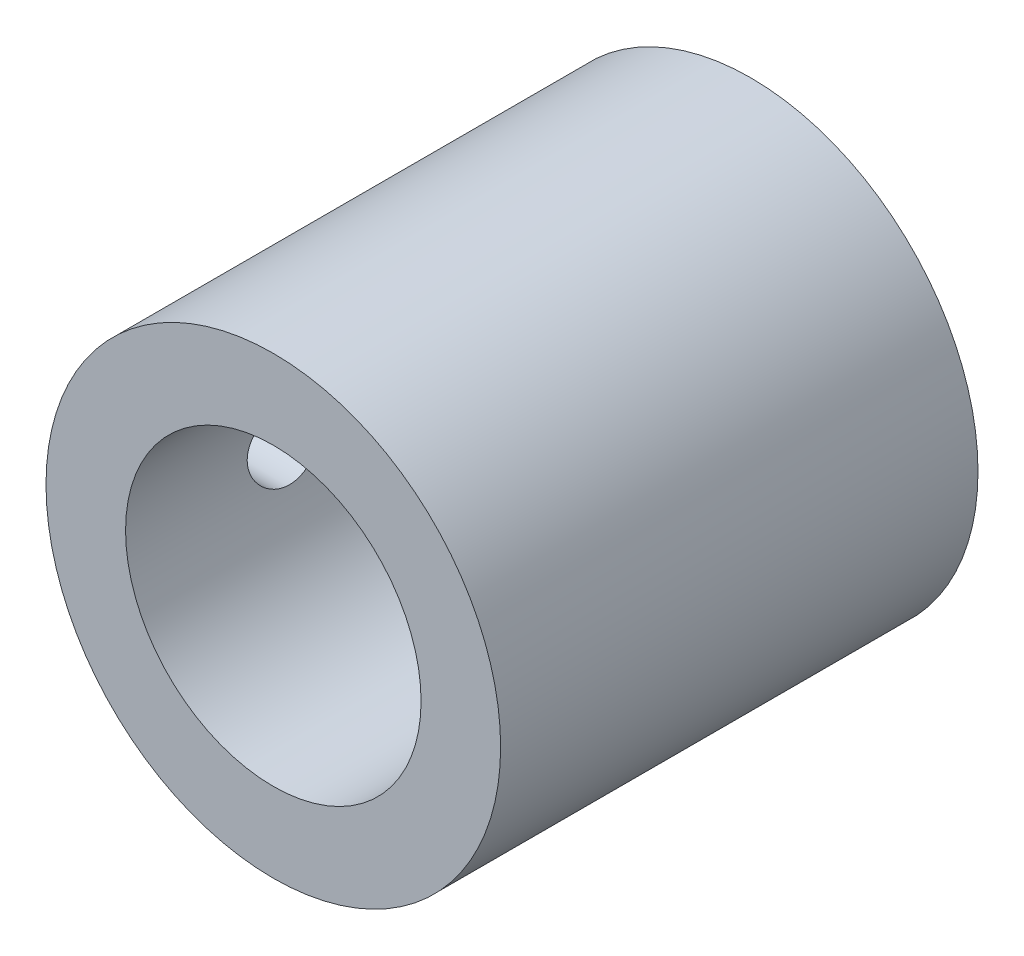
ISO-10303-21;
HEADER;
FILE_DESCRIPTION(('STEP AP214'),'2;1');
FILE_NAME('part.step','',(''),(''),'','','');
FILE_SCHEMA(('AUTOMOTIVE_DESIGN { 1 0 10303 214 1 1 1 1 }'));
ENDSEC;
DATA;
#1=APPLICATION_CONTEXT('core data for automotive mechanical design processes');
#2=APPLICATION_PROTOCOL_DEFINITION('international standard','automotive_design',2000,#1);
#3=PRODUCT_CONTEXT('',#1,'mechanical');
#4=PRODUCT('Part','Part','',(#3));
#5=PRODUCT_RELATED_PRODUCT_CATEGORY('part','',(#4));
#6=PRODUCT_DEFINITION_FORMATION('','',#4);
#7=PRODUCT_DEFINITION_CONTEXT('part definition',#1,'design');
#8=PRODUCT_DEFINITION('design','',#6,#7);
#9=PRODUCT_DEFINITION_SHAPE('','',#8);
#10=(LENGTH_UNIT() NAMED_UNIT(*) SI_UNIT(.MILLI.,.METRE.));
#11=(NAMED_UNIT(*) PLANE_ANGLE_UNIT() SI_UNIT($,.RADIAN.));
#12=(NAMED_UNIT(*) SI_UNIT($,.STERADIAN.) SOLID_ANGLE_UNIT());
#13=UNCERTAINTY_MEASURE_WITH_UNIT(LENGTH_MEASURE(1.E-05),#10,'distance_accuracy_value','');
#14=(GEOMETRIC_REPRESENTATION_CONTEXT(3) GLOBAL_UNCERTAINTY_ASSIGNED_CONTEXT((#13)) GLOBAL_UNIT_ASSIGNED_CONTEXT((#10,
#11,#12)) REPRESENTATION_CONTEXT('',''));
#15=CARTESIAN_POINT('',(0.,0.,0.));
#16=DIRECTION('',(0.,0.,1.));
#17=DIRECTION('',(1.,0.,0.));
#18=AXIS2_PLACEMENT_3D('',#15,#16,#17);
#19=CARTESIAN_POINT('',(0.,0.,0.));
#20=DIRECTION('',(0.,0.,1.));
#21=DIRECTION('',(1.,0.,0.));
#22=AXIS2_PLACEMENT_3D('',#19,#20,#21);
#23=PLANE('',#22);
#24=CARTESIAN_POINT('',(0.,0.,0.));
#25=DIRECTION('',(0.,0.,-1.));
#26=DIRECTION('',(-1.,0.,0.));
#27=AXIS2_PLACEMENT_3D('',#24,#25,#26);
#28=CIRCLE('',#27,3.35);
#29=CARTESIAN_POINT('',(-3.35,0.,0.));
#30=VERTEX_POINT('',#29);
#31=EDGE_CURVE('E184',#30,#30,#28,.T.);
#32=ORIENTED_EDGE('',*,*,#31,.F.);
#33=EDGE_LOOP('',(#32));
#34=FACE_BOUND('',#33,.T.);
#35=CARTESIAN_POINT('',(4.24264068711931,4.24264068711926,0.));
#36=DIRECTION('',(0.,0.,-1.));
#37=DIRECTION('',(-1.,0.,0.));
#38=AXIS2_PLACEMENT_3D('',#35,#36,#37);
#39=CIRCLE('',#38,1.24999999999999);
#40=CARTESIAN_POINT('',(2.99264068711932,4.24264068711926,0.));
#41=VERTEX_POINT('',#40);
#42=EDGE_CURVE('E90',#41,#41,#39,.T.);
#43=ORIENTED_EDGE('',*,*,#42,.F.);
#44=EDGE_LOOP('',(#43));
#45=FACE_BOUND('',#44,.T.);
#46=CARTESIAN_POINT('',(0.,0.,0.));
#47=DIRECTION('',(0.,0.,1.));
#48=DIRECTION('',(1.,0.,0.));
#49=AXIS2_PLACEMENT_3D('',#46,#47,#48);
#50=CIRCLE('',#49,10.);
#51=CARTESIAN_POINT('',(10.,0.,0.));
#52=VERTEX_POINT('',#51);
#53=EDGE_CURVE('E109',#52,#52,#50,.T.);
#54=ORIENTED_EDGE('',*,*,#53,.F.);
#55=EDGE_LOOP('',(#54));
#56=FACE_BOUND('',#55,.T.);
#57=CARTESIAN_POINT('',(4.24264068711931,-4.24264068711926,0.));
#58=DIRECTION('',(0.,0.,-1.));
#59=DIRECTION('',(-1.,0.,0.));
#60=AXIS2_PLACEMENT_3D('',#57,#58,#59);
#61=CIRCLE('',#60,1.24999999999999);
#62=CARTESIAN_POINT('',(2.99264068711932,-4.24264068711926,0.));
#63=VERTEX_POINT('',#62);
#64=EDGE_CURVE('E194',#63,#63,#61,.T.);
#65=ORIENTED_EDGE('',*,*,#64,.F.);
#66=EDGE_LOOP('',(#65));
#67=FACE_BOUND('',#66,.T.);
#68=CARTESIAN_POINT('',(-4.24264068711931,-4.24264068711926,0.));
#69=DIRECTION('',(0.,0.,-1.));
#70=DIRECTION('',(-1.,0.,0.));
#71=AXIS2_PLACEMENT_3D('',#68,#69,#70);
#72=CIRCLE('',#71,1.24999999999999);
#73=CARTESIAN_POINT('',(-5.4926406871193,-4.24264068711926,0.));
#74=VERTEX_POINT('',#73);
#75=EDGE_CURVE('E136',#74,#74,#72,.T.);
#76=ORIENTED_EDGE('',*,*,#75,.F.);
#77=EDGE_LOOP('',(#76));
#78=FACE_BOUND('',#77,.T.);
#79=CARTESIAN_POINT('',(-4.24264068711928,4.24264068711929,0.));
#80=DIRECTION('',(0.,0.,-1.));
#81=DIRECTION('',(-1.,0.,0.));
#82=AXIS2_PLACEMENT_3D('',#79,#80,#81);
#83=CIRCLE('',#82,1.24999999999999);
#84=CARTESIAN_POINT('',(-5.49264068711926,4.24264068711929,0.));
#85=VERTEX_POINT('',#84);
#86=EDGE_CURVE('E127',#85,#85,#83,.T.);
#87=ORIENTED_EDGE('',*,*,#86,.F.);
#88=EDGE_LOOP('',(#87));
#89=FACE_BOUND('',#88,.T.);
#90=ADVANCED_FACE('F41',(#34,#45,#56,#67,#78,#89),#23,.F.);
#91=CARTESIAN_POINT('',(0.,0.,21.));
#92=DIRECTION('',(0.,0.,-1.));
#93=DIRECTION('',(-1.,0.,0.));
#94=AXIS2_PLACEMENT_3D('',#91,#92,#93);
#95=CYLINDRICAL_SURFACE('',#94,10.);
#96=CARTESIAN_POINT('',(-10.,0.,15.65));
#97=CARTESIAN_POINT('',(-9.99999843258099,-0.0920114531057511,15.6499962990147));
#98=CARTESIAN_POINT('',(-9.99871684765511,-0.184073454347172,15.6422775413146));
#99=CARTESIAN_POINT('',(-9.99372775496381,-0.365616322535329,15.6116187648621));
#100=CARTESIAN_POINT('',(-9.99001800272159,-0.455094721351768,15.5886646630412));
#101=CARTESIAN_POINT('',(-9.98058875631552,-0.628817487751614,15.5282463610641));
#102=CARTESIAN_POINT('',(-9.974870893487,-0.713066038744484,15.4907939364397));
#103=CARTESIAN_POINT('',(-9.96205444853338,-0.87407223650404,15.4024727458514));
#104=CARTESIAN_POINT('',(-9.95495602786423,-0.950830757653326,15.351605548495));
#105=CARTESIAN_POINT('',(-9.9400912001718,-1.09540879372213,15.2373912228671));
#106=CARTESIAN_POINT('',(-9.93231968689365,-1.16314787882339,15.1739429363817));
#107=CARTESIAN_POINT('',(-9.9170237472334,-1.28706950777735,15.0365852264068));
#108=CARTESIAN_POINT('',(-9.90949933632427,-1.34325132909588,14.9626751493568));
#109=CARTESIAN_POINT('',(-9.89550007731641,-1.44278500045253,14.8059406563233));
#110=CARTESIAN_POINT('',(-9.88903182722124,-1.48605749570898,14.7230652056561));
#111=CARTESIAN_POINT('',(-9.87794796970923,-1.55803674048924,14.5510973747635));
#112=CARTESIAN_POINT('',(-9.8733322397089,-1.58674445381556,14.4620054063507));
#113=CARTESIAN_POINT('',(-9.86652679242373,-1.6285261950301,14.280985417999));
#114=CARTESIAN_POINT('',(-9.86431555933323,-1.64173895927951,14.1890902443212));
#115=CARTESIAN_POINT('',(-9.86250435770823,-1.65258585530687,14.0043626340766));
#116=CARTESIAN_POINT('',(-9.86290420804218,-1.65022106770359,13.9115302629694));
#117=CARTESIAN_POINT('',(-9.86625034802632,-1.63009303176277,13.7285527229433));
#118=CARTESIAN_POINT('',(-9.86917088684506,-1.61248549472487,13.6383898859726));
#119=CARTESIAN_POINT('',(-9.87718903199043,-1.56261607367809,13.4623159294666));
#120=CARTESIAN_POINT('',(-9.88228671162733,-1.53035369619838,13.3764049532117));
#121=CARTESIAN_POINT('',(-9.89411264039674,-1.45193210975571,13.2108064700756));
#122=CARTESIAN_POINT('',(-9.90084846298694,-1.4057081060585,13.1311502107593));
#123=CARTESIAN_POINT('',(-9.9151864393107,-1.30072141548377,12.9806656760922));
#124=CARTESIAN_POINT('',(-9.92278866158316,-1.24195773629986,12.9098381000877));
#125=CARTESIAN_POINT('',(-9.93811607123993,-1.11271072676603,12.7781200211173));
#126=CARTESIAN_POINT('',(-9.94584163094155,-1.04209376928223,12.71736060537));
#127=CARTESIAN_POINT('',(-9.96045987838133,-0.891597059898564,12.6085339783937));
#128=CARTESIAN_POINT('',(-9.9673525609492,-0.811717250503355,12.5604668459529));
#129=CARTESIAN_POINT('',(-9.97953794169528,-0.644840083170751,12.4783778494657));
#130=CARTESIAN_POINT('',(-9.98482933722619,-0.557837003156558,12.444367412362));
#131=CARTESIAN_POINT('',(-9.99320544362233,-0.37924693000247,12.3914780872247));
#132=CARTESIAN_POINT('',(-9.99629033536768,-0.287660313260821,12.3725979588552));
#133=CARTESIAN_POINT('',(-9.99988156603306,-0.103632983819162,12.3506825388388));
#134=CARTESIAN_POINT('',(-10.0004171933872,-0.0112142564118363,12.3474672638785));
#135=CARTESIAN_POINT('',(-9.99892971175882,0.17284150555468,12.3564931986803));
#136=CARTESIAN_POINT('',(-9.99690669920295,0.264478569441162,12.3687338259605));
#137=CARTESIAN_POINT('',(-9.99054737820398,0.443814955541767,12.4081744027771));
#138=CARTESIAN_POINT('',(-9.98622483070291,0.531534371938299,12.4352853943084));
#139=CARTESIAN_POINT('',(-9.97574921956607,0.70118295929459,12.5036023925551));
#140=CARTESIAN_POINT('',(-9.96959605484327,0.783111810188987,12.5448091776617));
#141=CARTESIAN_POINT('',(-9.95606928426946,0.939636398877248,12.640561319499));
#142=CARTESIAN_POINT('',(-9.94868555427359,1.01416235726447,12.6952192859171));
#143=CARTESIAN_POINT('',(-9.93354765732487,1.15304841333208,12.8161671490688));
#144=CARTESIAN_POINT('',(-9.92579346406183,1.21740778758216,12.8824578728543));
#145=CARTESIAN_POINT('',(-9.91069407401676,1.33479962911472,13.0255961063283));
#146=CARTESIAN_POINT('',(-9.90335382329476,1.38771058951943,13.1025438710988));
#147=CARTESIAN_POINT('',(-9.89000528724129,1.47985547415616,13.2643410470675));
#148=CARTESIAN_POINT('',(-9.88399696030451,1.51908982562647,13.3491902113319));
#149=CARTESIAN_POINT('',(-9.87402953570153,1.58258535747086,13.5240395324031));
#150=CARTESIAN_POINT('',(-9.87006212213643,1.60690737863648,13.6140170997967));
#151=CARTESIAN_POINT('',(-9.86460473721113,1.64007952798875,13.7968513117806));
#152=CARTESIAN_POINT('',(-9.86311455516768,1.64893097191818,13.8897077108482));
#153=CARTESIAN_POINT('',(-9.86278931217107,1.65087457438795,14.0744506413018));
#154=CARTESIAN_POINT('',(-9.86392203182987,1.64415796786953,14.1663351601921));
#155=CARTESIAN_POINT('',(-9.86864441177183,1.61556925478546,14.3476477518639));
#156=CARTESIAN_POINT('',(-9.87223406454433,1.59369719454886,14.4370758321536));
#157=CARTESIAN_POINT('',(-9.88145370519205,1.53549112071356,14.6108652424354));
#158=CARTESIAN_POINT('',(-9.88708141498759,1.49917324977365,14.695232107451));
#159=CARTESIAN_POINT('',(-9.89974533231771,1.41312606218934,14.8567062668603));
#160=CARTESIAN_POINT('',(-9.90678160742252,1.36339610211421,14.9338132127277));
#161=CARTESIAN_POINT('',(-9.92157214136343,1.25125259966706,15.0795454976377));
#162=CARTESIAN_POINT('',(-9.92933379899765,1.18869826623126,15.1480617598196));
#163=CARTESIAN_POINT('',(-9.94464125601211,1.05297867490409,15.2736905998767));
#164=CARTESIAN_POINT('',(-9.95218700513286,0.97981097009267,15.3308005407802));
#165=CARTESIAN_POINT('',(-9.96627143049842,0.824354696103045,15.4323474225735));
#166=CARTESIAN_POINT('',(-9.97280295936929,0.742007852048186,15.476696147978));
#167=CARTESIAN_POINT('',(-9.98405342047581,0.570959586923795,15.5508633528063));
#168=CARTESIAN_POINT('',(-9.98877416450827,0.482264623543764,15.5806963641252));
#169=CARTESIAN_POINT('',(-9.99483601455804,0.327682758240929,15.6184793415268));
#170=CARTESIAN_POINT('',(-9.99676220083327,0.2627330667111,15.6302807488145));
#171=CARTESIAN_POINT('',(-9.99934474465587,0.13186422762594,15.6460423389331));
#172=CARTESIAN_POINT('',(-10.0000011233775,0.0659450962546687,15.6500026525158));
#173=CARTESIAN_POINT('',(-10.,0.,15.65));
#174=B_SPLINE_CURVE_WITH_KNOTS('',3,(#96,#97,#98,#99,#100,#101,#102,#103,#104,#105,#106,#107,
#108,#109,#110,#111,#112,#113,#114,#115,#116,#117,#118,#119,#120,#121,#122,#123,#124,#125,#126,
#127,#128,#129,#130,#131,#132,#133,#134,#135,#136,#137,#138,#139,#140,#141,#142,#143,#144,#145,
#146,#147,#148,#149,#150,#151,#152,#153,#154,#155,#156,#157,#158,#159,#160,#161,#162,#163,#164,
#165,#166,#167,#168,#169,#170,#171,#172,#173),.UNSPECIFIED.,.T.,.F.,(4,2,2,2,2,2,2,2,2,2,2,2,2,
2,2,2,2,2,2,2,2,2,2,2,2,2,2,2,2,2,2,2,2,2,2,2,2,2,4),(0.,0.275793319008918,0.551841928312973,
0.827666799870598,1.1034594331417,1.38156673144316,1.65969141110741,1.93949209608633,
2.21927426326044,2.49653175525206,2.77377001402269,3.04820914252876,3.32265751287872,
3.59839967320042,3.87416366201707,4.1532757240192,4.43238951858747,4.71172976565332,
4.99104711092801,5.26714751096617,5.54323750600189,5.81769359979004,6.09216485190803,
6.36901711215386,6.64588906369257,6.92556925596459,7.20524071063228,7.48376340648033,
7.76226241335696,8.03735855216244,8.31245385002402,8.58724259883659,8.86204453269316,
9.14004258759617,9.41810483731131,9.69804546871318,9.97770526783281,10.1753710978727,
10.3730336317698),.UNSPECIFIED.);
#175=CARTESIAN_POINT('',(-10.,0.,15.65));
#176=VERTEX_POINT('',#175);
#177=EDGE_CURVE('E140',#176,#176,#174,.T.);
#178=ORIENTED_EDGE('',*,*,#177,.T.);
#179=EDGE_LOOP('',(#178));
#180=FACE_BOUND('',#179,.T.);
#181=CARTESIAN_POINT('',(0.,0.,21.));
#182=DIRECTION('',(0.,0.,1.));
#183=DIRECTION('',(1.,0.,0.));
#184=AXIS2_PLACEMENT_3D('',#181,#182,#183);
#185=CIRCLE('',#184,10.);
#186=CARTESIAN_POINT('',(10.,0.,21.));
#187=VERTEX_POINT('',#186);
#188=EDGE_CURVE('E148',#187,#187,#185,.T.);
#189=ORIENTED_EDGE('',*,*,#188,.F.);
#190=EDGE_LOOP('',(#189));
#191=FACE_BOUND('',#190,.T.);
#192=ORIENTED_EDGE('',*,*,#53,.T.);
#193=EDGE_LOOP('',(#192));
#194=FACE_BOUND('',#193,.T.);
#195=ADVANCED_FACE('F43',(#180,#191,#194),#95,.T.);
#196=CARTESIAN_POINT('',(0.,0.,21.));
#197=DIRECTION('',(0.,0.,1.));
#198=DIRECTION('',(1.,0.,0.));
#199=AXIS2_PLACEMENT_3D('',#196,#197,#198);
#200=PLANE('',#199);
#201=CARTESIAN_POINT('',(0.,0.,21.));
#202=DIRECTION('',(0.,0.,1.));
#203=DIRECTION('',(1.,0.,0.));
#204=AXIS2_PLACEMENT_3D('',#201,#202,#203);
#205=CIRCLE('',#204,6.5);
#206=CARTESIAN_POINT('',(6.5,0.,21.));
#207=VERTEX_POINT('',#206);
#208=EDGE_CURVE('E119',#207,#207,#205,.T.);
#209=ORIENTED_EDGE('',*,*,#208,.F.);
#210=EDGE_LOOP('',(#209));
#211=FACE_BOUND('',#210,.T.);
#212=ORIENTED_EDGE('',*,*,#188,.T.);
#213=EDGE_LOOP('',(#212));
#214=FACE_BOUND('',#213,.T.);
#215=ADVANCED_FACE('F169',(#211,#214),#200,.T.);
#216=CARTESIAN_POINT('',(0.,0.,6.));
#217=DIRECTION('',(0.,0.,1.));
#218=DIRECTION('',(1.,0.,0.));
#219=AXIS2_PLACEMENT_3D('',#216,#217,#218);
#220=CYLINDRICAL_SURFACE('',#219,6.5);
#221=CARTESIAN_POINT('',(-6.5,0.,15.65));
#222=CARTESIAN_POINT('',(-6.49999849148033,0.0911177503858731,15.6499975271443));
#223=CARTESIAN_POINT('',(-6.4980650151015,0.182262858095387,15.6424269510268));
#224=CARTESIAN_POINT('',(-6.49053943796148,0.361937820756668,15.6123918810941));
#225=CARTESIAN_POINT('',(-6.48494533438108,0.450466216312033,15.5899192338991));
#226=CARTESIAN_POINT('',(-6.47071750795578,0.622287397419872,15.5308498534362));
#227=CARTESIAN_POINT('',(-6.46208749750639,0.705586431636939,15.4942703651899));
#228=CARTESIAN_POINT('',(-6.44270535969817,0.864866150834567,15.4080870708407));
#229=CARTESIAN_POINT('',(-6.43195314475064,0.940846533563351,15.3584827271415));
#230=CARTESIAN_POINT('',(-6.40923777941342,1.08494165624619,15.2465480115112));
#231=CARTESIAN_POINT('',(-6.39725548483154,1.15287927915146,15.1839935093819));
#232=CARTESIAN_POINT('',(-6.37355665387331,1.2774205628457,15.0484138634561));
#233=CARTESIAN_POINT('',(-6.36184014855969,1.33402290487283,14.9753875030435));
#234=CARTESIAN_POINT('',(-6.33980584668286,1.43512676812558,14.8195531706555));
#235=CARTESIAN_POINT('',(-6.32951232072087,1.47942889215842,14.7366120872206));
#236=CARTESIAN_POINT('',(-6.31176915976443,1.55339199639589,14.5641559394432));
#237=CARTESIAN_POINT('',(-6.3043190546097,1.58305539735461,14.4746419648511));
#238=CARTESIAN_POINT('',(-6.29330322679464,1.62629233475194,14.2935317839025));
#239=CARTESIAN_POINT('',(-6.28966059809192,1.64018493928543,14.2020165371914));
#240=CARTESIAN_POINT('',(-6.28644204901193,1.65247997744377,14.0178874125951));
#241=CARTESIAN_POINT('',(-6.28686544513413,1.65088501453495,13.9252737219731));
#242=CARTESIAN_POINT('',(-6.29166204403964,1.63250447801232,13.74403211902));
#243=CARTESIAN_POINT('',(-6.29593604050051,1.61610042228528,13.6553624779331));
#244=CARTESIAN_POINT('',(-6.30779399869364,1.56917650684075,13.482076866203));
#245=CARTESIAN_POINT('',(-6.31537820273062,1.53865561377152,13.3974611928105));
#246=CARTESIAN_POINT('',(-6.33309221869858,1.46404250493563,13.233668872872));
#247=CARTESIAN_POINT('',(-6.34324760249032,1.41981289361812,13.154557696682));
#248=CARTESIAN_POINT('',(-6.364945442261,1.31913389984381,13.0047439402813));
#249=CARTESIAN_POINT('',(-6.37648814769664,1.26268231826682,12.9340428768687));
#250=CARTESIAN_POINT('',(-6.40007669661782,1.13719136135146,12.8008714139835));
#251=CARTESIAN_POINT('',(-6.41212734929307,1.06783038255625,12.7387045308094));
#252=CARTESIAN_POINT('',(-6.43506800190513,0.919522532515227,12.6268261884887));
#253=CARTESIAN_POINT('',(-6.4459579641844,0.840575350431436,12.5771151333895));
#254=CARTESIAN_POINT('',(-6.4654072019095,0.674894732770334,12.4914431523107));
#255=CARTESIAN_POINT('',(-6.47395787369381,0.588134074053322,12.4555327930044));
#256=CARTESIAN_POINT('',(-6.48770263023884,0.409541718403763,12.3988920585116));
#257=CARTESIAN_POINT('',(-6.49289737755419,0.317711026327971,12.3781586868498));
#258=CARTESIAN_POINT('',(-6.49924644511166,0.134179279177315,12.3529269360867));
#259=CARTESIAN_POINT('',(-6.5005035683198,0.0425384989604831,12.3480153835219));
#260=CARTESIAN_POINT('',(-6.4991291685556,-0.140255983188986,12.3534317074649));
#261=CARTESIAN_POINT('',(-6.49649800722503,-0.231409729628337,12.3637581667149));
#262=CARTESIAN_POINT('',(-6.48770867929811,-0.409198092309223,12.3990171731005));
#263=CARTESIAN_POINT('',(-6.48160524971031,-0.495880588598904,12.4237231766394));
#264=CARTESIAN_POINT('',(-6.46656022798463,-0.663865402904556,12.4867802242886));
#265=CARTESIAN_POINT('',(-6.45761834418719,-0.745167166996457,12.5251326706602));
#266=CARTESIAN_POINT('',(-6.4376432610754,-0.901717887469289,12.6151868784053));
#267=CARTESIAN_POINT('',(-6.42657501104735,-0.976830003962308,12.6671185596132));
#268=CARTESIAN_POINT('',(-6.40362831883756,-1.11741986610505,12.7825643066315));
#269=CARTESIAN_POINT('',(-6.39174973250325,-1.18289589099313,12.8460804366069));
#270=CARTESIAN_POINT('',(-6.36814923136526,-1.30406635448273,12.9848128318325));
#271=CARTESIAN_POINT('',(-6.35643893296219,-1.35947055793743,13.0602850051769));
#272=CARTESIAN_POINT('',(-6.33483594517711,-1.45682878188372,13.2196981261065));
#273=CARTESIAN_POINT('',(-6.32494317580465,-1.49878339435969,13.3036387007409));
#274=CARTESIAN_POINT('',(-6.30820564851897,-1.56773755394613,13.4771608999336));
#275=CARTESIAN_POINT('',(-6.30134291296739,-1.59482554658986,13.566705552564));
#276=CARTESIAN_POINT('',(-6.29142787777632,-1.63350588726022,13.7492797142624));
#277=CARTESIAN_POINT('',(-6.28837471379837,-1.64510175027641,13.8423084279103));
#278=CARTESIAN_POINT('',(-6.28649183842141,-1.65228074681225,14.0262525782131));
#279=CARTESIAN_POINT('',(-6.28753962152452,-1.64832832798558,14.1171489199998));
#280=CARTESIAN_POINT('',(-6.29345653429825,-1.62558916594653,14.2969334908211));
#281=CARTESIAN_POINT('',(-6.29832558250899,-1.60680273895831,14.3858217626213));
#282=CARTESIAN_POINT('',(-6.31126706173436,-1.55518610871843,14.5585440684628));
#283=CARTESIAN_POINT('',(-6.31931901702728,-1.522445569368,14.6424065380379));
#284=CARTESIAN_POINT('',(-6.3377213707967,-1.44392066335697,14.8035088724099));
#285=CARTESIAN_POINT('',(-6.34807209772023,-1.3981344324715,14.8807477886496));
#286=CARTESIAN_POINT('',(-6.37025290066772,-1.29337273284388,15.0286486942442));
#287=CARTESIAN_POINT('',(-6.38211523105464,-1.23407618889245,15.0990784573145));
#288=CARTESIAN_POINT('',(-6.40579298687251,-1.10459937775599,15.2291390142026));
#289=CARTESIAN_POINT('',(-6.41760840043669,-1.03441651710483,15.2887672273912));
#290=CARTESIAN_POINT('',(-6.44012670826218,-0.883564094524522,15.3966290836568));
#291=CARTESIAN_POINT('',(-6.45080446058256,-0.802721933411485,15.4446269911767));
#292=CARTESIAN_POINT('',(-6.46957701766543,-0.633851244249661,15.526274811358));
#293=CARTESIAN_POINT('',(-6.47767362922087,-0.545827797531961,15.5599347661284));
#294=CARTESIAN_POINT('',(-6.48920819390174,-0.381665270886311,15.6070903673807));
#295=CARTESIAN_POINT('',(-6.49322694643271,-0.306292143202488,15.62314612518));
#296=CARTESIAN_POINT('',(-6.49862338093772,-0.153952434713927,15.6446015591842));
#297=CARTESIAN_POINT('',(-6.50000127455811,-0.076985982102799,15.650002089332));
#298=CARTESIAN_POINT('',(-6.5,0.,15.65));
#299=B_SPLINE_CURVE_WITH_KNOTS('',3,(#221,#222,#223,#224,#225,#226,#227,#228,#229,#230,#231,
#232,#233,#234,#235,#236,#237,#238,#239,#240,#241,#242,#243,#244,#245,#246,#247,#248,#249,#250,
#251,#252,#253,#254,#255,#256,#257,#258,#259,#260,#261,#262,#263,#264,#265,#266,#267,#268,#269,
#270,#271,#272,#273,#274,#275,#276,#277,#278,#279,#280,#281,#282,#283,#284,#285,#286,#287,#288,
#289,#290,#291,#292,#293,#294,#295,#296,#297,#298),.UNSPECIFIED.,.T.,.F.,(4,2,2,2,2,2,2,2,2,2,2,
2,2,2,2,2,2,2,2,2,2,2,2,2,2,2,2,2,2,2,2,2,2,2,2,2,2,2,4),(0.,0.273071080673042,
0.546291690312233,0.819179352572715,1.09207827994795,1.37016840025652,1.64829085517239,
1.93068877591831,2.21303998185288,2.48957086262239,2.76605525924413,3.03561386213349,
3.30519219982155,3.5775648784331,3.84998660632107,4.13042684673474,4.41087618300893,
4.69234352388222,4.97375527812577,5.24775597584741,5.52173119090107,5.7915025937798,
6.06130172544543,6.33600366696577,6.61075460391992,6.89247457814753,7.17418215075422,
7.45419508187937,7.73414447043176,8.00579583650453,8.27744141180216,8.54736720344426,
8.81733158675164,9.09454331866244,9.37182119292242,9.65432089037337,9.93662240220948,
10.167360433645,10.398079972269),.UNSPECIFIED.);
#300=CARTESIAN_POINT('',(-6.5,0.,15.65));
#301=VERTEX_POINT('',#300);
#302=EDGE_CURVE('E122',#301,#301,#299,.T.);
#303=ORIENTED_EDGE('',*,*,#302,.T.);
#304=EDGE_LOOP('',(#303));
#305=FACE_BOUND('',#304,.T.);
#306=CARTESIAN_POINT('',(0.,0.,6.));
#307=DIRECTION('',(0.,0.,1.));
#308=DIRECTION('',(1.,0.,0.));
#309=AXIS2_PLACEMENT_3D('',#306,#307,#308);
#310=CIRCLE('',#309,6.5);
#311=CARTESIAN_POINT('',(3.67923766179357,-5.358470885247,6.));
#312=VERTEX_POINT('',#311);
#313=CARTESIAN_POINT('',(5.35847088524704,-3.67923766179351,6.));
#314=VERTEX_POINT('',#313);
#315=EDGE_CURVE('E106',#312,#314,#310,.T.);
#316=ORIENTED_EDGE('',*,*,#315,.F.);
#317=CARTESIAN_POINT('',(-3.67923766179357,-5.358470885247,6.));
#318=VERTEX_POINT('',#317);
#319=EDGE_CURVE('E113',#318,#312,#310,.T.);
#320=ORIENTED_EDGE('',*,*,#319,.F.);
#321=CARTESIAN_POINT('',(-5.35847088524704,-3.67923766179351,6.));
#322=VERTEX_POINT('',#321);
#323=EDGE_CURVE('E107',#322,#318,#310,.T.);
#324=ORIENTED_EDGE('',*,*,#323,.F.);
#325=CARTESIAN_POINT('',(-5.35847088524701,3.67923766179355,6.));
#326=VERTEX_POINT('',#325);
#327=EDGE_CURVE('E101',#326,#322,#310,.T.);
#328=ORIENTED_EDGE('',*,*,#327,.F.);
#329=CARTESIAN_POINT('',(-3.67923766179353,5.35847088524703,6.));
#330=VERTEX_POINT('',#329);
#331=EDGE_CURVE('E118',#330,#326,#310,.T.);
#332=ORIENTED_EDGE('',*,*,#331,.F.);
#333=CARTESIAN_POINT('',(3.67923766179357,5.358470885247,6.));
#334=VERTEX_POINT('',#333);
#335=EDGE_CURVE('E99',#334,#330,#310,.T.);
#336=ORIENTED_EDGE('',*,*,#335,.F.);
#337=CARTESIAN_POINT('',(5.35847088524704,3.67923766179351,6.));
#338=VERTEX_POINT('',#337);
#339=EDGE_CURVE('E89',#338,#334,#310,.T.);
#340=ORIENTED_EDGE('',*,*,#339,.F.);
#341=EDGE_CURVE('E97',#314,#338,#310,.T.);
#342=ORIENTED_EDGE('',*,*,#341,.F.);
#343=EDGE_LOOP('',(#316,#320,#324,#328,#332,#336,#340,#342));
#344=FACE_BOUND('',#343,.T.);
#345=ORIENTED_EDGE('',*,*,#208,.T.);
#346=EDGE_LOOP('',(#345));
#347=FACE_BOUND('',#346,.T.);
#348=ADVANCED_FACE('F95',(#305,#344,#347),#220,.F.);
#349=CARTESIAN_POINT('',(0.,0.,6.));
#350=DIRECTION('',(0.,0.,1.));
#351=DIRECTION('',(1.,0.,0.));
#352=AXIS2_PLACEMENT_3D('',#349,#350,#351);
#353=PLANE('',#352);
#354=CARTESIAN_POINT('',(0.,0.,6.));
#355=DIRECTION('',(0.,0.,1.));
#356=DIRECTION('',(1.,0.,0.));
#357=AXIS2_PLACEMENT_3D('',#354,#355,#356);
#358=CIRCLE('',#357,1.7);
#359=CARTESIAN_POINT('',(1.7,0.,6.));
#360=VERTEX_POINT('',#359);
#361=EDGE_CURVE('E46',#360,#360,#358,.T.);
#362=ORIENTED_EDGE('',*,*,#361,.F.);
#363=EDGE_LOOP('',(#362));
#364=FACE_BOUND('',#363,.T.);
#365=CARTESIAN_POINT('',(4.24264068711931,4.24264068711926,6.));
#366=DIRECTION('',(0.,0.,1.));
#367=DIRECTION('',(1.,0.,0.));
#368=AXIS2_PLACEMENT_3D('',#365,#366,#367);
#369=CIRCLE('',#368,1.24999999999999);
#370=EDGE_CURVE('E11',#334,#338,#369,.T.);
#371=ORIENTED_EDGE('',*,*,#370,.F.);
#372=ORIENTED_EDGE('',*,*,#335,.T.);
#373=CARTESIAN_POINT('',(-4.24264068711928,4.24264068711929,6.));
#374=DIRECTION('',(0.,0.,1.));
#375=DIRECTION('',(1.,0.,0.));
#376=AXIS2_PLACEMENT_3D('',#373,#374,#375);
#377=CIRCLE('',#376,1.24999999999999);
#378=EDGE_CURVE('E51',#326,#330,#377,.T.);
#379=ORIENTED_EDGE('',*,*,#378,.F.);
#380=ORIENTED_EDGE('',*,*,#327,.T.);
#381=CARTESIAN_POINT('',(-4.24264068711931,-4.24264068711926,6.));
#382=DIRECTION('',(0.,0.,1.));
#383=DIRECTION('',(1.,0.,0.));
#384=AXIS2_PLACEMENT_3D('',#381,#382,#383);
#385=CIRCLE('',#384,1.24999999999999);
#386=EDGE_CURVE('E130',#318,#322,#385,.T.);
#387=ORIENTED_EDGE('',*,*,#386,.F.);
#388=ORIENTED_EDGE('',*,*,#319,.T.);
#389=CARTESIAN_POINT('',(4.24264068711931,-4.24264068711926,6.));
#390=DIRECTION('',(0.,0.,1.));
#391=DIRECTION('',(1.,0.,0.));
#392=AXIS2_PLACEMENT_3D('',#389,#390,#391);
#393=CIRCLE('',#392,1.24999999999999);
#394=EDGE_CURVE('E105',#314,#312,#393,.T.);
#395=ORIENTED_EDGE('',*,*,#394,.F.);
#396=ORIENTED_EDGE('',*,*,#341,.T.);
#397=EDGE_LOOP('',(#371,#372,#379,#380,#387,#388,#395,#396));
#398=FACE_BOUND('',#397,.T.);
#399=ADVANCED_FACE('F103',(#364,#398),#353,.T.);
#400=CARTESIAN_POINT('',(-10.,0.,14.));
#401=DIRECTION('',(-1.,0.,0.));
#402=DIRECTION('',(0.,0.,1.));
#403=AXIS2_PLACEMENT_3D('',#400,#401,#402);
#404=CYLINDRICAL_SURFACE('',#403,1.64999999999999);
#405=ORIENTED_EDGE('',*,*,#177,.F.);
#406=EDGE_LOOP('',(#405));
#407=FACE_BOUND('',#406,.T.);
#408=ORIENTED_EDGE('',*,*,#302,.F.);
#409=EDGE_LOOP('',(#408));
#410=FACE_BOUND('',#409,.T.);
#411=ADVANCED_FACE('F150',(#407,#410),#404,.F.);
#412=CARTESIAN_POINT('',(0.,0.,6.));
#413=DIRECTION('',(0.,0.,1.));
#414=DIRECTION('',(1.,0.,0.));
#415=AXIS2_PLACEMENT_3D('',#412,#413,#414);
#416=PLANE('',#415);
#417=ORIENTED_EDGE('',*,*,#315,.T.);
#418=CARTESIAN_POINT('',(4.24264068711931,-4.24264068711926,6.));
#419=DIRECTION('',(0.,0.,1.));
#420=DIRECTION('',(1.,0.,0.));
#421=AXIS2_PLACEMENT_3D('',#418,#419,#420);
#422=CIRCLE('',#421,1.24999999999999);
#423=EDGE_CURVE('E164',#314,#312,#422,.F.);
#424=ORIENTED_EDGE('',*,*,#423,.T.);
#425=EDGE_LOOP('',(#417,#424));
#426=FACE_BOUND('',#425,.T.);
#427=ADVANCED_FACE('F155',(#426),#416,.F.);
#428=CARTESIAN_POINT('',(4.24264068711931,-4.24264068711926,0.));
#429=DIRECTION('',(0.,0.,-1.));
#430=DIRECTION('',(-1.,0.,0.));
#431=AXIS2_PLACEMENT_3D('',#428,#429,#430);
#432=CYLINDRICAL_SURFACE('',#431,1.24999999999999);
#433=ORIENTED_EDGE('',*,*,#64,.T.);
#434=EDGE_LOOP('',(#433));
#435=FACE_BOUND('',#434,.T.);
#436=ORIENTED_EDGE('',*,*,#394,.T.);
#437=ORIENTED_EDGE('',*,*,#423,.F.);
#438=EDGE_LOOP('',(#436,#437));
#439=FACE_BOUND('',#438,.T.);
#440=ADVANCED_FACE('F208',(#435,#439),#432,.F.);
#441=CARTESIAN_POINT('',(-4.24264068711931,-4.24264068711926,0.));
#442=DIRECTION('',(0.,0.,-1.));
#443=DIRECTION('',(-1.,0.,0.));
#444=AXIS2_PLACEMENT_3D('',#441,#442,#443);
#445=CYLINDRICAL_SURFACE('',#444,1.24999999999999);
#446=ORIENTED_EDGE('',*,*,#75,.T.);
#447=EDGE_LOOP('',(#446));
#448=FACE_BOUND('',#447,.T.);
#449=ORIENTED_EDGE('',*,*,#386,.T.);
#450=CARTESIAN_POINT('',(-4.24264068711931,-4.24264068711926,6.));
#451=DIRECTION('',(0.,0.,1.));
#452=DIRECTION('',(1.,0.,0.));
#453=AXIS2_PLACEMENT_3D('',#450,#451,#452);
#454=CIRCLE('',#453,1.24999999999999);
#455=EDGE_CURVE('E133',#318,#322,#454,.F.);
#456=ORIENTED_EDGE('',*,*,#455,.F.);
#457=EDGE_LOOP('',(#449,#456));
#458=FACE_BOUND('',#457,.T.);
#459=ADVANCED_FACE('F138',(#448,#458),#445,.F.);
#460=CARTESIAN_POINT('',(0.,0.,6.));
#461=DIRECTION('',(0.,0.,1.));
#462=DIRECTION('',(1.,0.,0.));
#463=AXIS2_PLACEMENT_3D('',#460,#461,#462);
#464=PLANE('',#463);
#465=ORIENTED_EDGE('',*,*,#323,.T.);
#466=ORIENTED_EDGE('',*,*,#455,.T.);
#467=EDGE_LOOP('',(#465,#466));
#468=FACE_BOUND('',#467,.T.);
#469=ADVANCED_FACE('F134',(#468),#464,.F.);
#470=CARTESIAN_POINT('',(-4.24264068711928,4.24264068711929,0.));
#471=DIRECTION('',(0.,0.,-1.));
#472=DIRECTION('',(-1.,0.,0.));
#473=AXIS2_PLACEMENT_3D('',#470,#471,#472);
#474=CYLINDRICAL_SURFACE('',#473,1.24999999999999);
#475=ORIENTED_EDGE('',*,*,#86,.T.);
#476=EDGE_LOOP('',(#475));
#477=FACE_BOUND('',#476,.T.);
#478=ORIENTED_EDGE('',*,*,#378,.T.);
#479=CARTESIAN_POINT('',(-4.24264068711928,4.24264068711929,6.));
#480=DIRECTION('',(0.,0.,1.));
#481=DIRECTION('',(1.,0.,0.));
#482=AXIS2_PLACEMENT_3D('',#479,#480,#481);
#483=CIRCLE('',#482,1.24999999999999);
#484=EDGE_CURVE('E63',#326,#330,#483,.F.);
#485=ORIENTED_EDGE('',*,*,#484,.F.);
#486=EDGE_LOOP('',(#478,#485));
#487=FACE_BOUND('',#486,.T.);
#488=ADVANCED_FACE('F129',(#477,#487),#474,.F.);
#489=CARTESIAN_POINT('',(0.,0.,6.));
#490=DIRECTION('',(0.,0.,1.));
#491=DIRECTION('',(1.,0.,0.));
#492=AXIS2_PLACEMENT_3D('',#489,#490,#491);
#493=PLANE('',#492);
#494=ORIENTED_EDGE('',*,*,#331,.T.);
#495=ORIENTED_EDGE('',*,*,#484,.T.);
#496=EDGE_LOOP('',(#494,#495));
#497=FACE_BOUND('',#496,.T.);
#498=ADVANCED_FACE('F126',(#497),#493,.F.);
#499=CARTESIAN_POINT('',(0.,0.,6.));
#500=DIRECTION('',(0.,0.,1.));
#501=DIRECTION('',(1.,0.,0.));
#502=AXIS2_PLACEMENT_3D('',#499,#500,#501);
#503=PLANE('',#502);
#504=ORIENTED_EDGE('',*,*,#339,.T.);
#505=CARTESIAN_POINT('',(4.24264068711931,4.24264068711926,6.));
#506=DIRECTION('',(0.,0.,1.));
#507=DIRECTION('',(1.,0.,0.));
#508=AXIS2_PLACEMENT_3D('',#505,#506,#507);
#509=CIRCLE('',#508,1.24999999999999);
#510=EDGE_CURVE('E56',#334,#338,#509,.F.);
#511=ORIENTED_EDGE('',*,*,#510,.T.);
#512=EDGE_LOOP('',(#504,#511));
#513=FACE_BOUND('',#512,.T.);
#514=ADVANCED_FACE('F88',(#513),#503,.F.);
#515=CARTESIAN_POINT('',(4.24264068711931,4.24264068711926,0.));
#516=DIRECTION('',(0.,0.,-1.));
#517=DIRECTION('',(-1.,0.,0.));
#518=AXIS2_PLACEMENT_3D('',#515,#516,#517);
#519=CYLINDRICAL_SURFACE('',#518,1.24999999999999);
#520=ORIENTED_EDGE('',*,*,#42,.T.);
#521=EDGE_LOOP('',(#520));
#522=FACE_BOUND('',#521,.T.);
#523=ORIENTED_EDGE('',*,*,#370,.T.);
#524=ORIENTED_EDGE('',*,*,#510,.F.);
#525=EDGE_LOOP('',(#523,#524));
#526=FACE_BOUND('',#525,.T.);
#527=ADVANCED_FACE('F82',(#522,#526),#519,.F.);
#528=CARTESIAN_POINT('',(0.,0.,0.));
#529=DIRECTION('',(0.,0.,-1.));
#530=DIRECTION('',(-1.,0.,0.));
#531=AXIS2_PLACEMENT_3D('',#528,#529,#530);
#532=CYLINDRICAL_SURFACE('',#531,1.7);
#533=ORIENTED_EDGE('',*,*,#361,.T.);
#534=EDGE_LOOP('',(#533));
#535=FACE_BOUND('',#534,.T.);
#536=CARTESIAN_POINT('',(0.,0.,1.8));
#537=DIRECTION('',(0.,0.,-1.));
#538=DIRECTION('',(-1.,0.,0.));
#539=AXIS2_PLACEMENT_3D('',#536,#537,#538);
#540=CIRCLE('',#539,1.7);
#541=CARTESIAN_POINT('',(-1.7,0.,1.8));
#542=VERTEX_POINT('',#541);
#543=EDGE_CURVE('E246',#542,#542,#540,.T.);
#544=ORIENTED_EDGE('',*,*,#543,.T.);
#545=EDGE_LOOP('',(#544));
#546=FACE_BOUND('',#545,.T.);
#547=ADVANCED_FACE('F227',(#535,#546),#532,.F.);
#548=CARTESIAN_POINT('',(1.7,0.,1.8));
#549=DIRECTION('',(0.,0.,1.));
#550=DIRECTION('',(1.,0.,0.));
#551=AXIS2_PLACEMENT_3D('',#548,#549,#550);
#552=PLANE('',#551);
#553=ORIENTED_EDGE('',*,*,#543,.F.);
#554=EDGE_LOOP('',(#553));
#555=FACE_BOUND('',#554,.T.);
#556=CARTESIAN_POINT('',(0.,0.,1.8));
#557=DIRECTION('',(0.,0.,-1.));
#558=DIRECTION('',(-1.,0.,0.));
#559=AXIS2_PLACEMENT_3D('',#556,#557,#558);
#560=CIRCLE('',#559,3.35);
#561=CARTESIAN_POINT('',(-3.35,0.,1.8));
#562=VERTEX_POINT('',#561);
#563=EDGE_CURVE('E244',#562,#562,#560,.T.);
#564=ORIENTED_EDGE('',*,*,#563,.T.);
#565=EDGE_LOOP('',(#564));
#566=FACE_BOUND('',#565,.T.);
#567=ADVANCED_FACE('F231',(#555,#566),#552,.F.);
#568=CARTESIAN_POINT('',(0.,0.,0.));
#569=DIRECTION('',(0.,0.,-1.));
#570=DIRECTION('',(-1.,0.,0.));
#571=AXIS2_PLACEMENT_3D('',#568,#569,#570);
#572=CYLINDRICAL_SURFACE('',#571,3.35);
#573=ORIENTED_EDGE('',*,*,#563,.F.);
#574=EDGE_LOOP('',(#573));
#575=FACE_BOUND('',#574,.T.);
#576=ORIENTED_EDGE('',*,*,#31,.T.);
#577=EDGE_LOOP('',(#576));
#578=FACE_BOUND('',#577,.T.);
#579=ADVANCED_FACE('F235',(#575,#578),#572,.F.);
#580=CLOSED_SHELL('',(#90,#195,#215,#348,#399,#411,#427,#440,#459,#469,#488,#498,#514,#527,#547,
#567,#579));
#581=MANIFOLD_SOLID_BREP('B2',#580);
#582=ADVANCED_BREP_SHAPE_REPRESENTATION('',(#18,#581),#14);
#583=SHAPE_DEFINITION_REPRESENTATION(#9,#582);
ENDSEC;
END-ISO-10303-21;
